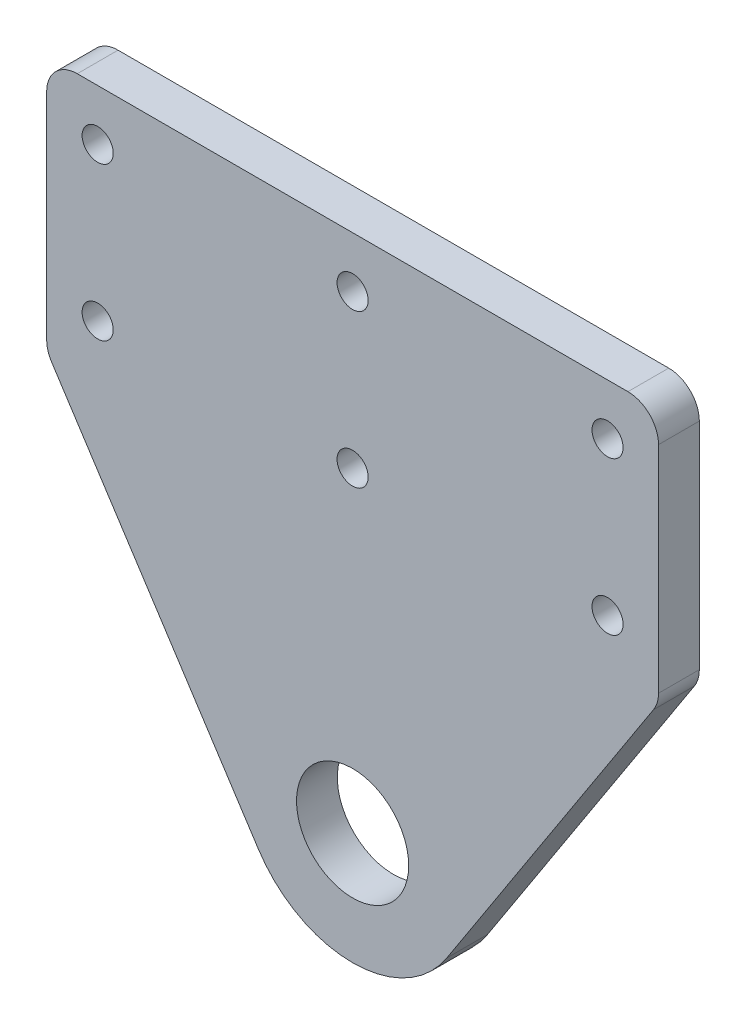
ISO-10303-21;
HEADER;
FILE_DESCRIPTION(('STEP AP214'),'2;1');
FILE_NAME('part.step','',(''),(''),'','','');
FILE_SCHEMA(('AUTOMOTIVE_DESIGN { 1 0 10303 214 1 1 1 1 }'));
ENDSEC;
DATA;
#1=APPLICATION_CONTEXT('core data for automotive mechanical design processes');
#2=APPLICATION_PROTOCOL_DEFINITION('international standard','automotive_design',2000,#1);
#3=PRODUCT_CONTEXT('',#1,'mechanical');
#4=PRODUCT('Part','Part','',(#3));
#5=PRODUCT_RELATED_PRODUCT_CATEGORY('part','',(#4));
#6=PRODUCT_DEFINITION_FORMATION('','',#4);
#7=PRODUCT_DEFINITION_CONTEXT('part definition',#1,'design');
#8=PRODUCT_DEFINITION('design','',#6,#7);
#9=PRODUCT_DEFINITION_SHAPE('','',#8);
#10=(LENGTH_UNIT() NAMED_UNIT(*) SI_UNIT(.MILLI.,.METRE.));
#11=(NAMED_UNIT(*) PLANE_ANGLE_UNIT() SI_UNIT($,.RADIAN.));
#12=(NAMED_UNIT(*) SI_UNIT($,.STERADIAN.) SOLID_ANGLE_UNIT());
#13=UNCERTAINTY_MEASURE_WITH_UNIT(LENGTH_MEASURE(1.E-05),#10,'distance_accuracy_value','');
#14=(GEOMETRIC_REPRESENTATION_CONTEXT(3) GLOBAL_UNCERTAINTY_ASSIGNED_CONTEXT((#13)) GLOBAL_UNIT_ASSIGNED_CONTEXT((#10,
#11,#12)) REPRESENTATION_CONTEXT('',''));
#15=CARTESIAN_POINT('',(0.,0.,0.));
#16=DIRECTION('',(0.,0.,1.));
#17=DIRECTION('',(1.,0.,0.));
#18=AXIS2_PLACEMENT_3D('',#15,#16,#17);
#19=CARTESIAN_POINT('',(0.,0.,4.));
#20=DIRECTION('',(0.,0.,1.));
#21=DIRECTION('',(1.,0.,0.));
#22=AXIS2_PLACEMENT_3D('',#19,#20,#21);
#23=PLANE('',#22);
#24=CARTESIAN_POINT('',(25.,31.,4.));
#25=DIRECTION('',(0.,0.,1.));
#26=DIRECTION('',(1.,0.,0.));
#27=AXIS2_PLACEMENT_3D('',#24,#25,#26);
#28=CIRCLE('',#27,1.525);
#29=CARTESIAN_POINT('',(26.525,31.,4.));
#30=VERTEX_POINT('',#29);
#31=EDGE_CURVE('E208',#30,#30,#28,.T.);
#32=ORIENTED_EDGE('',*,*,#31,.F.);
#33=EDGE_LOOP('',(#32));
#34=FACE_BOUND('',#33,.T.);
#35=CARTESIAN_POINT('',(0.,46.,4.));
#36=DIRECTION('',(0.,0.,1.));
#37=DIRECTION('',(1.,0.,0.));
#38=AXIS2_PLACEMENT_3D('',#35,#36,#37);
#39=CIRCLE('',#38,1.525);
#40=CARTESIAN_POINT('',(1.52499999999999,46.,4.));
#41=VERTEX_POINT('',#40);
#42=EDGE_CURVE('E212',#41,#41,#39,.T.);
#43=ORIENTED_EDGE('',*,*,#42,.F.);
#44=EDGE_LOOP('',(#43));
#45=FACE_BOUND('',#44,.T.);
#46=CARTESIAN_POINT('',(0.,31.,4.));
#47=DIRECTION('',(0.,0.,1.));
#48=DIRECTION('',(1.,0.,0.));
#49=AXIS2_PLACEMENT_3D('',#46,#47,#48);
#50=CIRCLE('',#49,1.525);
#51=CARTESIAN_POINT('',(1.52499999999999,31.,4.));
#52=VERTEX_POINT('',#51);
#53=EDGE_CURVE('E215',#52,#52,#50,.T.);
#54=ORIENTED_EDGE('',*,*,#53,.F.);
#55=EDGE_LOOP('',(#54));
#56=FACE_BOUND('',#55,.T.);
#57=CARTESIAN_POINT('',(-25.,46.,4.));
#58=DIRECTION('',(0.,0.,1.));
#59=DIRECTION('',(1.,0.,0.));
#60=AXIS2_PLACEMENT_3D('',#57,#58,#59);
#61=CIRCLE('',#60,1.525);
#62=CARTESIAN_POINT('',(-23.475,46.,4.));
#63=VERTEX_POINT('',#62);
#64=EDGE_CURVE('E218',#63,#63,#61,.T.);
#65=ORIENTED_EDGE('',*,*,#64,.F.);
#66=EDGE_LOOP('',(#65));
#67=FACE_BOUND('',#66,.T.);
#68=CARTESIAN_POINT('',(25.,46.,4.));
#69=DIRECTION('',(0.,0.,1.));
#70=DIRECTION('',(1.,0.,0.));
#71=AXIS2_PLACEMENT_3D('',#68,#69,#70);
#72=CIRCLE('',#71,1.525);
#73=CARTESIAN_POINT('',(26.525,46.,4.));
#74=VERTEX_POINT('',#73);
#75=EDGE_CURVE('E221',#74,#74,#72,.T.);
#76=ORIENTED_EDGE('',*,*,#75,.F.);
#77=EDGE_LOOP('',(#76));
#78=FACE_BOUND('',#77,.T.);
#79=CARTESIAN_POINT('',(-25.,31.,4.));
#80=DIRECTION('',(0.,0.,1.));
#81=DIRECTION('',(1.,0.,0.));
#82=AXIS2_PLACEMENT_3D('',#79,#80,#81);
#83=CIRCLE('',#82,1.525);
#84=CARTESIAN_POINT('',(-23.475,31.,4.));
#85=VERTEX_POINT('',#84);
#86=EDGE_CURVE('E224',#85,#85,#83,.T.);
#87=ORIENTED_EDGE('',*,*,#86,.F.);
#88=EDGE_LOOP('',(#87));
#89=FACE_BOUND('',#88,.T.);
#90=DIRECTION('',(-1.,0.,0.));
#91=VECTOR('',#90,1.);
#92=CARTESIAN_POINT('',(-30.,51.,4.));
#93=LINE('',#92,#91);
#94=CARTESIAN_POINT('',(27.,51.,4.));
#95=VERTEX_POINT('',#94);
#96=CARTESIAN_POINT('',(-27.,51.,4.));
#97=VERTEX_POINT('',#96);
#98=EDGE_CURVE('E204',#95,#97,#93,.T.);
#99=ORIENTED_EDGE('',*,*,#98,.T.);
#100=CARTESIAN_POINT('',(-27.,48.,4.));
#101=DIRECTION('',(0.,0.,1.));
#102=DIRECTION('',(1.,0.,0.));
#103=AXIS2_PLACEMENT_3D('',#100,#101,#102);
#104=CIRCLE('',#103,3.);
#105=CARTESIAN_POINT('',(-30.,48.,4.));
#106=VERTEX_POINT('',#105);
#107=EDGE_CURVE('E166',#97,#106,#104,.T.);
#108=ORIENTED_EDGE('',*,*,#107,.T.);
#109=DIRECTION('',(0.,-1.,0.));
#110=VECTOR('',#109,1.);
#111=CARTESIAN_POINT('',(-30.,26.,4.));
#112=LINE('',#111,#110);
#113=CARTESIAN_POINT('',(-30.,26.8886191886967,4.));
#114=VERTEX_POINT('',#113);
#115=EDGE_CURVE('E202',#106,#114,#112,.T.);
#116=ORIENTED_EDGE('',*,*,#115,.T.);
#117=CARTESIAN_POINT('',(-27.,26.8886191886967,4.));
#118=DIRECTION('',(0.,0.,1.));
#119=DIRECTION('',(1.,0.,0.));
#120=AXIS2_PLACEMENT_3D('',#117,#118,#119);
#121=CIRCLE('',#120,3.);
#122=CARTESIAN_POINT('',(-29.5160330299179,25.2547349234068,4.));
#123=VERTEX_POINT('',#122);
#124=EDGE_CURVE('E50',#114,#123,#121,.T.);
#125=ORIENTED_EDGE('',*,*,#124,.T.);
#126=DIRECTION('',(0.544628088429974,-0.838677676639311,0.));
#127=VECTOR('',#126,1.);
#128=CARTESIAN_POINT('',(-9.22545444303241,-5.99090897272972,4.));
#129=LINE('',#128,#127);
#130=CARTESIAN_POINT('',(-9.22545444303241,-5.99090897272972,4.));
#131=VERTEX_POINT('',#130);
#132=EDGE_CURVE('E129',#123,#131,#129,.T.);
#133=ORIENTED_EDGE('',*,*,#132,.T.);
#134=CARTESIAN_POINT('',(0.,0.,4.));
#135=DIRECTION('',(0.,0.,1.));
#136=DIRECTION('',(1.,0.,0.));
#137=AXIS2_PLACEMENT_3D('',#134,#135,#136);
#138=CIRCLE('',#137,11.);
#139=CARTESIAN_POINT('',(9.22545444303243,-5.99090897272971,4.));
#140=VERTEX_POINT('',#139);
#141=EDGE_CURVE('E124',#131,#140,#138,.T.);
#142=ORIENTED_EDGE('',*,*,#141,.T.);
#143=DIRECTION('',(0.544628088429974,0.838677676639311,0.));
#144=VECTOR('',#143,1.);
#145=CARTESIAN_POINT('',(9.22545444303243,-5.99090897272971,4.));
#146=LINE('',#145,#144);
#147=CARTESIAN_POINT('',(29.5160330299179,25.2547349234068,4.));
#148=VERTEX_POINT('',#147);
#149=EDGE_CURVE('E114',#140,#148,#146,.T.);
#150=ORIENTED_EDGE('',*,*,#149,.T.);
#151=CARTESIAN_POINT('',(27.,26.8886191886967,4.));
#152=DIRECTION('',(0.,0.,1.));
#153=DIRECTION('',(1.,0.,0.));
#154=AXIS2_PLACEMENT_3D('',#151,#152,#153);
#155=CIRCLE('',#154,3.);
#156=CARTESIAN_POINT('',(30.,26.8886191886967,4.));
#157=VERTEX_POINT('',#156);
#158=EDGE_CURVE('E163',#148,#157,#155,.T.);
#159=ORIENTED_EDGE('',*,*,#158,.T.);
#160=DIRECTION('',(0.,1.,0.));
#161=VECTOR('',#160,1.);
#162=CARTESIAN_POINT('',(30.,26.,4.));
#163=LINE('',#162,#161);
#164=CARTESIAN_POINT('',(30.,48.,4.));
#165=VERTEX_POINT('',#164);
#166=EDGE_CURVE('E123',#157,#165,#163,.T.);
#167=ORIENTED_EDGE('',*,*,#166,.T.);
#168=CARTESIAN_POINT('',(27.,48.,4.));
#169=DIRECTION('',(0.,0.,1.));
#170=DIRECTION('',(1.,0.,0.));
#171=AXIS2_PLACEMENT_3D('',#168,#169,#170);
#172=CIRCLE('',#171,3.);
#173=EDGE_CURVE('E161',#165,#95,#172,.T.);
#174=ORIENTED_EDGE('',*,*,#173,.T.);
#175=EDGE_LOOP('',(#99,#108,#116,#125,#133,#142,#150,#159,#167,#174));
#176=FACE_BOUND('',#175,.T.);
#177=CARTESIAN_POINT('',(0.,0.,4.));
#178=DIRECTION('',(0.,0.,1.));
#179=DIRECTION('',(1.,0.,0.));
#180=AXIS2_PLACEMENT_3D('',#177,#178,#179);
#181=CIRCLE('',#180,5.5);
#182=CARTESIAN_POINT('',(5.5,0.,4.));
#183=VERTEX_POINT('',#182);
#184=EDGE_CURVE('E196',#183,#183,#181,.T.);
#185=ORIENTED_EDGE('',*,*,#184,.F.);
#186=EDGE_LOOP('',(#185));
#187=FACE_BOUND('',#186,.T.);
#188=ADVANCED_FACE('F35',(#34,#45,#56,#67,#78,#89,#176,#187),#23,.T.);
#189=CARTESIAN_POINT('',(0.,0.,0.));
#190=DIRECTION('',(0.,0.,1.));
#191=DIRECTION('',(1.,0.,0.));
#192=AXIS2_PLACEMENT_3D('',#189,#190,#191);
#193=PLANE('',#192);
#194=CARTESIAN_POINT('',(25.,31.,0.));
#195=DIRECTION('',(0.,0.,-1.));
#196=DIRECTION('',(-1.,0.,0.));
#197=AXIS2_PLACEMENT_3D('',#194,#195,#196);
#198=CIRCLE('',#197,1.525);
#199=CARTESIAN_POINT('',(23.475,31.,0.));
#200=VERTEX_POINT('',#199);
#201=EDGE_CURVE('E237',#200,#200,#198,.T.);
#202=ORIENTED_EDGE('',*,*,#201,.F.);
#203=EDGE_LOOP('',(#202));
#204=FACE_BOUND('',#203,.T.);
#205=CARTESIAN_POINT('',(0.,46.,0.));
#206=DIRECTION('',(0.,0.,-1.));
#207=DIRECTION('',(-1.,0.,0.));
#208=AXIS2_PLACEMENT_3D('',#205,#206,#207);
#209=CIRCLE('',#208,1.525);
#210=CARTESIAN_POINT('',(-1.52500000000001,46.,0.));
#211=VERTEX_POINT('',#210);
#212=EDGE_CURVE('E234',#211,#211,#209,.T.);
#213=ORIENTED_EDGE('',*,*,#212,.F.);
#214=EDGE_LOOP('',(#213));
#215=FACE_BOUND('',#214,.T.);
#216=CARTESIAN_POINT('',(0.,31.,0.));
#217=DIRECTION('',(0.,0.,-1.));
#218=DIRECTION('',(-1.,0.,0.));
#219=AXIS2_PLACEMENT_3D('',#216,#217,#218);
#220=CIRCLE('',#219,1.525);
#221=CARTESIAN_POINT('',(-1.52500000000001,31.,0.));
#222=VERTEX_POINT('',#221);
#223=EDGE_CURVE('E231',#222,#222,#220,.T.);
#224=ORIENTED_EDGE('',*,*,#223,.F.);
#225=EDGE_LOOP('',(#224));
#226=FACE_BOUND('',#225,.T.);
#227=CARTESIAN_POINT('',(-25.,46.,0.));
#228=DIRECTION('',(0.,0.,-1.));
#229=DIRECTION('',(-1.,0.,0.));
#230=AXIS2_PLACEMENT_3D('',#227,#228,#229);
#231=CIRCLE('',#230,1.525);
#232=CARTESIAN_POINT('',(-26.525,46.,0.));
#233=VERTEX_POINT('',#232);
#234=EDGE_CURVE('E230',#233,#233,#231,.T.);
#235=ORIENTED_EDGE('',*,*,#234,.F.);
#236=EDGE_LOOP('',(#235));
#237=FACE_BOUND('',#236,.T.);
#238=CARTESIAN_POINT('',(25.,46.,0.));
#239=DIRECTION('',(0.,0.,-1.));
#240=DIRECTION('',(-1.,0.,0.));
#241=AXIS2_PLACEMENT_3D('',#238,#239,#240);
#242=CIRCLE('',#241,1.525);
#243=CARTESIAN_POINT('',(23.475,46.,0.));
#244=VERTEX_POINT('',#243);
#245=EDGE_CURVE('E240',#244,#244,#242,.T.);
#246=ORIENTED_EDGE('',*,*,#245,.F.);
#247=EDGE_LOOP('',(#246));
#248=FACE_BOUND('',#247,.T.);
#249=CARTESIAN_POINT('',(-25.,31.,0.));
#250=DIRECTION('',(0.,0.,-1.));
#251=DIRECTION('',(-1.,0.,0.));
#252=AXIS2_PLACEMENT_3D('',#249,#250,#251);
#253=CIRCLE('',#252,1.525);
#254=CARTESIAN_POINT('',(-26.525,31.,0.));
#255=VERTEX_POINT('',#254);
#256=EDGE_CURVE('E227',#255,#255,#253,.T.);
#257=ORIENTED_EDGE('',*,*,#256,.F.);
#258=EDGE_LOOP('',(#257));
#259=FACE_BOUND('',#258,.T.);
#260=DIRECTION('',(0.,-1.,0.));
#261=VECTOR('',#260,1.);
#262=CARTESIAN_POINT('',(-30.,26.,0.));
#263=LINE('',#262,#261);
#264=CARTESIAN_POINT('',(-30.,48.,0.));
#265=VERTEX_POINT('',#264);
#266=CARTESIAN_POINT('',(-30.,26.8886191886967,0.));
#267=VERTEX_POINT('',#266);
#268=EDGE_CURVE('E186',#265,#267,#263,.T.);
#269=ORIENTED_EDGE('',*,*,#268,.F.);
#270=CARTESIAN_POINT('',(-27.,48.,0.));
#271=DIRECTION('',(0.,0.,1.));
#272=DIRECTION('',(1.,0.,0.));
#273=AXIS2_PLACEMENT_3D('',#270,#271,#272);
#274=CIRCLE('',#273,3.);
#275=CARTESIAN_POINT('',(-27.,51.,0.));
#276=VERTEX_POINT('',#275);
#277=EDGE_CURVE('E154',#265,#276,#274,.F.);
#278=ORIENTED_EDGE('',*,*,#277,.T.);
#279=DIRECTION('',(-1.,0.,0.));
#280=VECTOR('',#279,1.);
#281=CARTESIAN_POINT('',(-30.,51.,0.));
#282=LINE('',#281,#280);
#283=CARTESIAN_POINT('',(27.,51.,0.));
#284=VERTEX_POINT('',#283);
#285=EDGE_CURVE('E182',#284,#276,#282,.T.);
#286=ORIENTED_EDGE('',*,*,#285,.F.);
#287=CARTESIAN_POINT('',(27.,48.,0.));
#288=DIRECTION('',(0.,0.,1.));
#289=DIRECTION('',(1.,0.,0.));
#290=AXIS2_PLACEMENT_3D('',#287,#288,#289);
#291=CIRCLE('',#290,3.);
#292=CARTESIAN_POINT('',(30.,48.,0.));
#293=VERTEX_POINT('',#292);
#294=EDGE_CURVE('E148',#284,#293,#291,.F.);
#295=ORIENTED_EDGE('',*,*,#294,.T.);
#296=DIRECTION('',(0.,1.,0.));
#297=VECTOR('',#296,1.);
#298=CARTESIAN_POINT('',(30.,26.,0.));
#299=LINE('',#298,#297);
#300=CARTESIAN_POINT('',(30.,26.8886191886967,0.));
#301=VERTEX_POINT('',#300);
#302=EDGE_CURVE('E175',#301,#293,#299,.T.);
#303=ORIENTED_EDGE('',*,*,#302,.F.);
#304=CARTESIAN_POINT('',(27.,26.8886191886967,0.));
#305=DIRECTION('',(0.,0.,1.));
#306=DIRECTION('',(1.,0.,0.));
#307=AXIS2_PLACEMENT_3D('',#304,#305,#306);
#308=CIRCLE('',#307,3.);
#309=CARTESIAN_POINT('',(29.5160330299179,25.2547349234068,0.));
#310=VERTEX_POINT('',#309);
#311=EDGE_CURVE('E150',#301,#310,#308,.F.);
#312=ORIENTED_EDGE('',*,*,#311,.T.);
#313=DIRECTION('',(0.544628088429974,0.838677676639311,0.));
#314=VECTOR('',#313,1.);
#315=CARTESIAN_POINT('',(9.22545444303243,-5.99090897272971,0.));
#316=LINE('',#315,#314);
#317=CARTESIAN_POINT('',(9.22545444303243,-5.99090897272971,0.));
#318=VERTEX_POINT('',#317);
#319=EDGE_CURVE('E183',#318,#310,#316,.T.);
#320=ORIENTED_EDGE('',*,*,#319,.F.);
#321=CARTESIAN_POINT('',(0.,0.,0.));
#322=DIRECTION('',(0.,0.,1.));
#323=DIRECTION('',(1.,0.,0.));
#324=AXIS2_PLACEMENT_3D('',#321,#322,#323);
#325=CIRCLE('',#324,11.);
#326=CARTESIAN_POINT('',(-9.22545444303241,-5.99090897272972,0.));
#327=VERTEX_POINT('',#326);
#328=EDGE_CURVE('E137',#327,#318,#325,.T.);
#329=ORIENTED_EDGE('',*,*,#328,.F.);
#330=DIRECTION('',(0.544628088429974,-0.838677676639311,0.));
#331=VECTOR('',#330,1.);
#332=CARTESIAN_POINT('',(-9.22545444303241,-5.99090897272972,0.));
#333=LINE('',#332,#331);
#334=CARTESIAN_POINT('',(-29.5160330299179,25.2547349234068,0.));
#335=VERTEX_POINT('',#334);
#336=EDGE_CURVE('E133',#335,#327,#333,.T.);
#337=ORIENTED_EDGE('',*,*,#336,.F.);
#338=CARTESIAN_POINT('',(-27.,26.8886191886967,0.));
#339=DIRECTION('',(0.,0.,1.));
#340=DIRECTION('',(1.,0.,0.));
#341=AXIS2_PLACEMENT_3D('',#338,#339,#340);
#342=CIRCLE('',#341,3.);
#343=EDGE_CURVE('E152',#335,#267,#342,.F.);
#344=ORIENTED_EDGE('',*,*,#343,.T.);
#345=EDGE_LOOP('',(#269,#278,#286,#295,#303,#312,#320,#329,#337,#344));
#346=FACE_BOUND('',#345,.T.);
#347=CARTESIAN_POINT('',(0.,0.,0.));
#348=DIRECTION('',(0.,0.,1.));
#349=DIRECTION('',(1.,0.,0.));
#350=AXIS2_PLACEMENT_3D('',#347,#348,#349);
#351=CIRCLE('',#350,5.5);
#352=CARTESIAN_POINT('',(5.5,0.,0.));
#353=VERTEX_POINT('',#352);
#354=EDGE_CURVE('E198',#353,#353,#351,.T.);
#355=ORIENTED_EDGE('',*,*,#354,.T.);
#356=EDGE_LOOP('',(#355));
#357=FACE_BOUND('',#356,.T.);
#358=ADVANCED_FACE('F179',(#204,#215,#226,#237,#248,#259,#346,#357),#193,.F.);
#359=CARTESIAN_POINT('',(0.,0.,4.));
#360=DIRECTION('',(0.,0.,-1.));
#361=DIRECTION('',(-1.,0.,0.));
#362=AXIS2_PLACEMENT_3D('',#359,#360,#361);
#363=CYLINDRICAL_SURFACE('',#362,11.);
#364=ORIENTED_EDGE('',*,*,#328,.T.);
#365=DIRECTION('',(0.,0.,-1.));
#366=VECTOR('',#365,1.);
#367=CARTESIAN_POINT('',(9.22545444303243,-5.99090897272971,4.));
#368=LINE('',#367,#366);
#369=EDGE_CURVE('E119',#140,#318,#368,.T.);
#370=ORIENTED_EDGE('',*,*,#369,.F.);
#371=ORIENTED_EDGE('',*,*,#141,.F.);
#372=DIRECTION('',(0.,0.,-1.));
#373=VECTOR('',#372,1.);
#374=CARTESIAN_POINT('',(-9.22545444303241,-5.99090897272972,4.));
#375=LINE('',#374,#373);
#376=EDGE_CURVE('E139',#131,#327,#375,.T.);
#377=ORIENTED_EDGE('',*,*,#376,.T.);
#378=EDGE_LOOP('',(#364,#370,#371,#377));
#379=FACE_BOUND('',#378,.T.);
#380=ADVANCED_FACE('F135',(#379),#363,.T.);
#381=CARTESIAN_POINT('',(9.22545444303243,-5.99090897272971,4.));
#382=DIRECTION('',(-0.838677676639311,0.544628088429974,0.));
#383=DIRECTION('',(-0.544628088429974,-0.838677676639311,0.));
#384=AXIS2_PLACEMENT_3D('',#381,#382,#383);
#385=PLANE('',#384);
#386=ORIENTED_EDGE('',*,*,#319,.T.);
#387=DIRECTION('',(0.,0.,-1.));
#388=VECTOR('',#387,1.);
#389=CARTESIAN_POINT('',(29.5160330299179,25.2547349234068,4.));
#390=LINE('',#389,#388);
#391=EDGE_CURVE('E11',#310,#148,#390,.F.);
#392=ORIENTED_EDGE('',*,*,#391,.T.);
#393=ORIENTED_EDGE('',*,*,#149,.F.);
#394=ORIENTED_EDGE('',*,*,#369,.T.);
#395=EDGE_LOOP('',(#386,#392,#393,#394));
#396=FACE_BOUND('',#395,.T.);
#397=ADVANCED_FACE('F117',(#396),#385,.F.);
#398=CARTESIAN_POINT('',(30.,26.,4.));
#399=DIRECTION('',(-1.,0.,0.));
#400=DIRECTION('',(0.,-1.,0.));
#401=AXIS2_PLACEMENT_3D('',#398,#399,#400);
#402=PLANE('',#401);
#403=ORIENTED_EDGE('',*,*,#166,.F.);
#404=DIRECTION('',(0.,0.,-1.));
#405=VECTOR('',#404,1.);
#406=CARTESIAN_POINT('',(30.,26.8886191886967,4.));
#407=LINE('',#406,#405);
#408=EDGE_CURVE('E43',#157,#301,#407,.T.);
#409=ORIENTED_EDGE('',*,*,#408,.T.);
#410=ORIENTED_EDGE('',*,*,#302,.T.);
#411=DIRECTION('',(0.,0.,-1.));
#412=VECTOR('',#411,1.);
#413=CARTESIAN_POINT('',(30.,48.,4.));
#414=LINE('',#413,#412);
#415=EDGE_CURVE('E58',#293,#165,#414,.F.);
#416=ORIENTED_EDGE('',*,*,#415,.T.);
#417=EDGE_LOOP('',(#403,#409,#410,#416));
#418=FACE_BOUND('',#417,.T.);
#419=ADVANCED_FACE('F174',(#418),#402,.F.);
#420=CARTESIAN_POINT('',(-30.,51.,4.));
#421=DIRECTION('',(0.,-1.,0.));
#422=DIRECTION('',(1.,0.,0.));
#423=AXIS2_PLACEMENT_3D('',#420,#421,#422);
#424=PLANE('',#423);
#425=ORIENTED_EDGE('',*,*,#285,.T.);
#426=DIRECTION('',(0.,0.,-1.));
#427=VECTOR('',#426,1.);
#428=CARTESIAN_POINT('',(-27.,51.,4.));
#429=LINE('',#428,#427);
#430=EDGE_CURVE('E159',#276,#97,#429,.F.);
#431=ORIENTED_EDGE('',*,*,#430,.T.);
#432=ORIENTED_EDGE('',*,*,#98,.F.);
#433=DIRECTION('',(0.,0.,-1.));
#434=VECTOR('',#433,1.);
#435=CARTESIAN_POINT('',(27.,51.,4.));
#436=LINE('',#435,#434);
#437=EDGE_CURVE('E156',#95,#284,#436,.T.);
#438=ORIENTED_EDGE('',*,*,#437,.T.);
#439=EDGE_LOOP('',(#425,#431,#432,#438));
#440=FACE_BOUND('',#439,.T.);
#441=ADVANCED_FACE('F283',(#440),#424,.F.);
#442=CARTESIAN_POINT('',(-30.,26.,4.));
#443=DIRECTION('',(1.,0.,0.));
#444=DIRECTION('',(0.,0.,-1.));
#445=AXIS2_PLACEMENT_3D('',#442,#443,#444);
#446=PLANE('',#445);
#447=ORIENTED_EDGE('',*,*,#115,.F.);
#448=DIRECTION('',(0.,0.,-1.));
#449=VECTOR('',#448,1.);
#450=CARTESIAN_POINT('',(-30.,48.,4.));
#451=LINE('',#450,#449);
#452=EDGE_CURVE('E141',#106,#265,#451,.T.);
#453=ORIENTED_EDGE('',*,*,#452,.T.);
#454=ORIENTED_EDGE('',*,*,#268,.T.);
#455=DIRECTION('',(0.,0.,-1.));
#456=VECTOR('',#455,1.);
#457=CARTESIAN_POINT('',(-30.,26.8886191886967,4.));
#458=LINE('',#457,#456);
#459=EDGE_CURVE('E138',#267,#114,#458,.F.);
#460=ORIENTED_EDGE('',*,*,#459,.T.);
#461=EDGE_LOOP('',(#447,#453,#454,#460));
#462=FACE_BOUND('',#461,.T.);
#463=ADVANCED_FACE('F280',(#462),#446,.F.);
#464=CARTESIAN_POINT('',(-9.22545444303241,-5.99090897272972,4.));
#465=DIRECTION('',(0.838677676639311,0.544628088429974,0.));
#466=DIRECTION('',(-0.544628088429974,0.838677676639311,0.));
#467=AXIS2_PLACEMENT_3D('',#464,#465,#466);
#468=PLANE('',#467);
#469=ORIENTED_EDGE('',*,*,#132,.F.);
#470=DIRECTION('',(0.,0.,-1.));
#471=VECTOR('',#470,1.);
#472=CARTESIAN_POINT('',(-29.5160330299179,25.2547349234068,4.));
#473=LINE('',#472,#471);
#474=EDGE_CURVE('E168',#123,#335,#473,.T.);
#475=ORIENTED_EDGE('',*,*,#474,.T.);
#476=ORIENTED_EDGE('',*,*,#336,.T.);
#477=ORIENTED_EDGE('',*,*,#376,.F.);
#478=EDGE_LOOP('',(#469,#475,#476,#477));
#479=FACE_BOUND('',#478,.T.);
#480=ADVANCED_FACE('F194',(#479),#468,.F.);
#481=CARTESIAN_POINT('',(0.,0.,4.));
#482=DIRECTION('',(0.,0.,-1.));
#483=DIRECTION('',(-1.,0.,0.));
#484=AXIS2_PLACEMENT_3D('',#481,#482,#483);
#485=CYLINDRICAL_SURFACE('',#484,5.5);
#486=ORIENTED_EDGE('',*,*,#184,.T.);
#487=EDGE_LOOP('',(#486));
#488=FACE_BOUND('',#487,.T.);
#489=ORIENTED_EDGE('',*,*,#354,.F.);
#490=EDGE_LOOP('',(#489));
#491=FACE_BOUND('',#490,.T.);
#492=ADVANCED_FACE('F276',(#488,#491),#485,.F.);
#493=CARTESIAN_POINT('',(-27.,48.,4.));
#494=DIRECTION('',(0.,0.,-1.));
#495=DIRECTION('',(-1.,0.,0.));
#496=AXIS2_PLACEMENT_3D('',#493,#494,#495);
#497=CYLINDRICAL_SURFACE('',#496,3.);
#498=ORIENTED_EDGE('',*,*,#107,.F.);
#499=ORIENTED_EDGE('',*,*,#430,.F.);
#500=ORIENTED_EDGE('',*,*,#277,.F.);
#501=ORIENTED_EDGE('',*,*,#452,.F.);
#502=EDGE_LOOP('',(#498,#499,#500,#501));
#503=FACE_BOUND('',#502,.T.);
#504=ADVANCED_FACE('F294',(#503),#497,.T.);
#505=CARTESIAN_POINT('',(-27.,26.8886191886967,4.));
#506=DIRECTION('',(0.,0.,-1.));
#507=DIRECTION('',(-1.,0.,0.));
#508=AXIS2_PLACEMENT_3D('',#505,#506,#507);
#509=CYLINDRICAL_SURFACE('',#508,3.);
#510=ORIENTED_EDGE('',*,*,#124,.F.);
#511=ORIENTED_EDGE('',*,*,#459,.F.);
#512=ORIENTED_EDGE('',*,*,#343,.F.);
#513=ORIENTED_EDGE('',*,*,#474,.F.);
#514=EDGE_LOOP('',(#510,#511,#512,#513));
#515=FACE_BOUND('',#514,.T.);
#516=ADVANCED_FACE('F297',(#515),#509,.T.);
#517=CARTESIAN_POINT('',(27.,26.8886191886967,4.));
#518=DIRECTION('',(0.,0.,-1.));
#519=DIRECTION('',(-1.,0.,0.));
#520=AXIS2_PLACEMENT_3D('',#517,#518,#519);
#521=CYLINDRICAL_SURFACE('',#520,3.);
#522=ORIENTED_EDGE('',*,*,#158,.F.);
#523=ORIENTED_EDGE('',*,*,#391,.F.);
#524=ORIENTED_EDGE('',*,*,#311,.F.);
#525=ORIENTED_EDGE('',*,*,#408,.F.);
#526=EDGE_LOOP('',(#522,#523,#524,#525));
#527=FACE_BOUND('',#526,.T.);
#528=ADVANCED_FACE('F265',(#527),#521,.T.);
#529=CARTESIAN_POINT('',(27.,48.,4.));
#530=DIRECTION('',(0.,0.,-1.));
#531=DIRECTION('',(-1.,0.,0.));
#532=AXIS2_PLACEMENT_3D('',#529,#530,#531);
#533=CYLINDRICAL_SURFACE('',#532,3.);
#534=ORIENTED_EDGE('',*,*,#173,.F.);
#535=ORIENTED_EDGE('',*,*,#415,.F.);
#536=ORIENTED_EDGE('',*,*,#294,.F.);
#537=ORIENTED_EDGE('',*,*,#437,.F.);
#538=EDGE_LOOP('',(#534,#535,#536,#537));
#539=FACE_BOUND('',#538,.T.);
#540=ADVANCED_FACE('F37',(#539),#533,.T.);
#541=CARTESIAN_POINT('',(-25.,31.,10.));
#542=DIRECTION('',(0.,0.,-1.));
#543=DIRECTION('',(-1.,0.,0.));
#544=AXIS2_PLACEMENT_3D('',#541,#542,#543);
#545=CYLINDRICAL_SURFACE('',#544,1.525);
#546=ORIENTED_EDGE('',*,*,#86,.T.);
#547=EDGE_LOOP('',(#546));
#548=FACE_BOUND('',#547,.T.);
#549=ORIENTED_EDGE('',*,*,#256,.T.);
#550=EDGE_LOOP('',(#549));
#551=FACE_BOUND('',#550,.T.);
#552=ADVANCED_FACE('F254',(#548,#551),#545,.F.);
#553=CARTESIAN_POINT('',(25.,46.,10.));
#554=DIRECTION('',(0.,0.,-1.));
#555=DIRECTION('',(-1.,0.,0.));
#556=AXIS2_PLACEMENT_3D('',#553,#554,#555);
#557=CYLINDRICAL_SURFACE('',#556,1.525);
#558=ORIENTED_EDGE('',*,*,#75,.T.);
#559=EDGE_LOOP('',(#558));
#560=FACE_BOUND('',#559,.T.);
#561=ORIENTED_EDGE('',*,*,#245,.T.);
#562=EDGE_LOOP('',(#561));
#563=FACE_BOUND('',#562,.T.);
#564=ADVANCED_FACE('F246',(#560,#563),#557,.F.);
#565=CARTESIAN_POINT('',(-25.,46.,10.));
#566=DIRECTION('',(0.,0.,-1.));
#567=DIRECTION('',(-1.,0.,0.));
#568=AXIS2_PLACEMENT_3D('',#565,#566,#567);
#569=CYLINDRICAL_SURFACE('',#568,1.525);
#570=ORIENTED_EDGE('',*,*,#64,.T.);
#571=EDGE_LOOP('',(#570));
#572=FACE_BOUND('',#571,.T.);
#573=ORIENTED_EDGE('',*,*,#234,.T.);
#574=EDGE_LOOP('',(#573));
#575=FACE_BOUND('',#574,.T.);
#576=ADVANCED_FACE('F262',(#572,#575),#569,.F.);
#577=CARTESIAN_POINT('',(0.,31.,10.));
#578=DIRECTION('',(0.,0.,-1.));
#579=DIRECTION('',(-1.,0.,0.));
#580=AXIS2_PLACEMENT_3D('',#577,#578,#579);
#581=CYLINDRICAL_SURFACE('',#580,1.525);
#582=ORIENTED_EDGE('',*,*,#53,.T.);
#583=EDGE_LOOP('',(#582));
#584=FACE_BOUND('',#583,.T.);
#585=ORIENTED_EDGE('',*,*,#223,.T.);
#586=EDGE_LOOP('',(#585));
#587=FACE_BOUND('',#586,.T.);
#588=ADVANCED_FACE('F348',(#584,#587),#581,.F.);
#589=CARTESIAN_POINT('',(0.,46.,10.));
#590=DIRECTION('',(0.,0.,-1.));
#591=DIRECTION('',(-1.,0.,0.));
#592=AXIS2_PLACEMENT_3D('',#589,#590,#591);
#593=CYLINDRICAL_SURFACE('',#592,1.525);
#594=ORIENTED_EDGE('',*,*,#42,.T.);
#595=EDGE_LOOP('',(#594));
#596=FACE_BOUND('',#595,.T.);
#597=ORIENTED_EDGE('',*,*,#212,.T.);
#598=EDGE_LOOP('',(#597));
#599=FACE_BOUND('',#598,.T.);
#600=ADVANCED_FACE('F358',(#596,#599),#593,.F.);
#601=CARTESIAN_POINT('',(25.,31.,10.));
#602=DIRECTION('',(0.,0.,-1.));
#603=DIRECTION('',(-1.,0.,0.));
#604=AXIS2_PLACEMENT_3D('',#601,#602,#603);
#605=CYLINDRICAL_SURFACE('',#604,1.525);
#606=ORIENTED_EDGE('',*,*,#31,.T.);
#607=EDGE_LOOP('',(#606));
#608=FACE_BOUND('',#607,.T.);
#609=ORIENTED_EDGE('',*,*,#201,.T.);
#610=EDGE_LOOP('',(#609));
#611=FACE_BOUND('',#610,.T.);
#612=ADVANCED_FACE('F367',(#608,#611),#605,.F.);
#613=CLOSED_SHELL('',(#188,#358,#380,#397,#419,#441,#463,#480,#492,#504,#516,#528,#540,#552,
#564,#576,#588,#600,#612));
#614=MANIFOLD_SOLID_BREP('B2',#613);
#615=ADVANCED_BREP_SHAPE_REPRESENTATION('',(#18,#614),#14);
#616=SHAPE_DEFINITION_REPRESENTATION(#9,#615);
ENDSEC;
END-ISO-10303-21;
